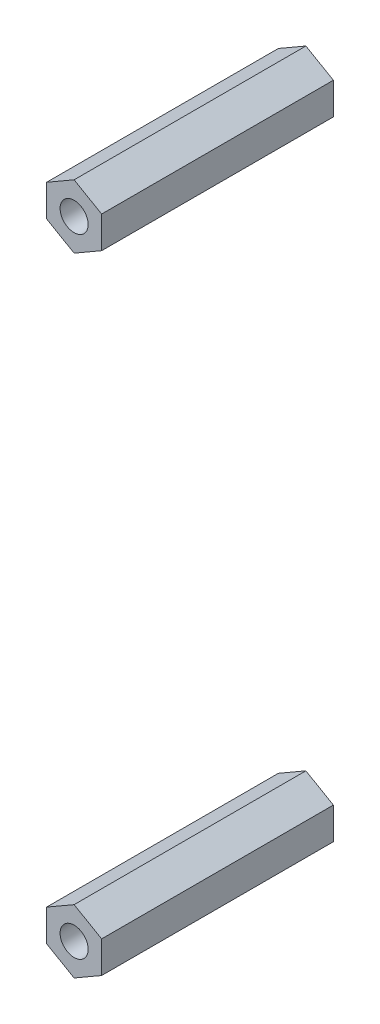
ISO-10303-21;
HEADER;
FILE_DESCRIPTION(('STEP AP214'),'2;1');
FILE_NAME('part.step','',(''),(''),'','','');
FILE_SCHEMA(('AUTOMOTIVE_DESIGN { 1 0 10303 214 1 1 1 1 }'));
ENDSEC;
DATA;
#1=APPLICATION_CONTEXT('core data for automotive mechanical design processes');
#2=APPLICATION_PROTOCOL_DEFINITION('international standard','automotive_design',2000,#1);
#3=PRODUCT_CONTEXT('',#1,'mechanical');
#4=PRODUCT('Part','Part','',(#3));
#5=PRODUCT_RELATED_PRODUCT_CATEGORY('part','',(#4));
#6=PRODUCT_DEFINITION_FORMATION('','',#4);
#7=PRODUCT_DEFINITION_CONTEXT('part definition',#1,'design');
#8=PRODUCT_DEFINITION('design','',#6,#7);
#9=PRODUCT_DEFINITION_SHAPE('','',#8);
#10=(LENGTH_UNIT() NAMED_UNIT(*) SI_UNIT(.MILLI.,.METRE.));
#11=(NAMED_UNIT(*) PLANE_ANGLE_UNIT() SI_UNIT($,.RADIAN.));
#12=(NAMED_UNIT(*) SI_UNIT($,.STERADIAN.) SOLID_ANGLE_UNIT());
#13=UNCERTAINTY_MEASURE_WITH_UNIT(LENGTH_MEASURE(1.E-05),#10,'distance_accuracy_value','');
#14=(GEOMETRIC_REPRESENTATION_CONTEXT(3) GLOBAL_UNCERTAINTY_ASSIGNED_CONTEXT((#13)) GLOBAL_UNIT_ASSIGNED_CONTEXT((#10,
#11,#12)) REPRESENTATION_CONTEXT('',''));
#15=CARTESIAN_POINT('',(0.,0.,0.));
#16=DIRECTION('',(0.,0.,1.));
#17=DIRECTION('',(1.,0.,0.));
#18=AXIS2_PLACEMENT_3D('',#15,#16,#17);
#19=CARTESIAN_POINT('',(-39.8780000000002,-45.4910072060575,111.324967005515));
#20=DIRECTION('',(-0.5,0.866025403784439,0.));
#21=DIRECTION('',(-0.866025403784439,-0.5,0.));
#22=AXIS2_PLACEMENT_3D('',#19,#20,#21);
#23=PLANE('',#22);
#24=DIRECTION('',(0.866025403784439,0.5,0.));
#25=VECTOR('',#24,1.);
#26=CARTESIAN_POINT('',(-39.8780000000002,-45.4910072060575,91.7701999999998));
#27=LINE('',#26,#25);
#28=CARTESIAN_POINT('',(-39.8780000000002,-45.4910072060575,91.7701999999998));
#29=VERTEX_POINT('',#28);
#30=CARTESIAN_POINT('',(-33.4772000000002,-41.7955036030285,91.7701999999998));
#31=VERTEX_POINT('',#30);
#32=EDGE_CURVE('E104',#29,#31,#27,.T.);
#33=ORIENTED_EDGE('',*,*,#32,.F.);
#34=DIRECTION('',(0.,0.,-1.));
#35=VECTOR('',#34,1.);
#36=CARTESIAN_POINT('',(-39.8780000000002,-45.4910072060575,111.324967005515));
#37=LINE('',#36,#35);
#38=CARTESIAN_POINT('',(-39.8780000000002,-45.4910072060575,37.8459999999998));
#39=VERTEX_POINT('',#38);
#40=EDGE_CURVE('E64',#29,#39,#37,.T.);
#41=ORIENTED_EDGE('',*,*,#40,.T.);
#42=DIRECTION('',(0.866025403784439,0.5,0.));
#43=VECTOR('',#42,1.);
#44=CARTESIAN_POINT('',(-39.8780000000002,-45.4910072060575,37.8459999999998));
#45=LINE('',#44,#43);
#46=CARTESIAN_POINT('',(-33.4772000000002,-41.7955036030285,37.8459999999998));
#47=VERTEX_POINT('',#46);
#48=EDGE_CURVE('E107',#39,#47,#45,.T.);
#49=ORIENTED_EDGE('',*,*,#48,.T.);
#50=DIRECTION('',(0.,0.,-1.));
#51=VECTOR('',#50,1.);
#52=CARTESIAN_POINT('',(-33.4772000000002,-41.7955036030285,111.324967005515));
#53=LINE('',#52,#51);
#54=EDGE_CURVE('E101',#31,#47,#53,.T.);
#55=ORIENTED_EDGE('',*,*,#54,.F.);
#56=EDGE_LOOP('',(#33,#41,#49,#55));
#57=FACE_BOUND('',#56,.T.);
#58=ADVANCED_FACE('F48',(#57),#23,.F.);
#59=CARTESIAN_POINT('',(-46.2788000000002,-41.7955036030285,111.324967005515));
#60=DIRECTION('',(0.499999999999999,0.866025403784439,0.));
#61=DIRECTION('',(-0.866025403784439,0.499999999999999,0.));
#62=AXIS2_PLACEMENT_3D('',#59,#60,#61);
#63=PLANE('',#62);
#64=DIRECTION('',(0.866025403784439,-0.499999999999999,0.));
#65=VECTOR('',#64,1.);
#66=CARTESIAN_POINT('',(-46.2788000000002,-41.7955036030285,91.7701999999998));
#67=LINE('',#66,#65);
#68=CARTESIAN_POINT('',(-46.2788000000002,-41.7955036030285,91.7701999999998));
#69=VERTEX_POINT('',#68);
#70=EDGE_CURVE('E119',#69,#29,#67,.T.);
#71=ORIENTED_EDGE('',*,*,#70,.F.);
#72=DIRECTION('',(0.,0.,-1.));
#73=VECTOR('',#72,1.);
#74=CARTESIAN_POINT('',(-46.2788000000002,-41.7955036030285,111.324967005515));
#75=LINE('',#74,#73);
#76=CARTESIAN_POINT('',(-46.2788000000002,-41.7955036030285,37.8459999999998));
#77=VERTEX_POINT('',#76);
#78=EDGE_CURVE('E147',#69,#77,#75,.T.);
#79=ORIENTED_EDGE('',*,*,#78,.T.);
#80=DIRECTION('',(0.866025403784439,-0.499999999999999,0.));
#81=VECTOR('',#80,1.);
#82=CARTESIAN_POINT('',(-46.2788000000002,-41.7955036030285,37.8459999999998));
#83=LINE('',#82,#81);
#84=EDGE_CURVE('E143',#77,#39,#83,.T.);
#85=ORIENTED_EDGE('',*,*,#84,.T.);
#86=ORIENTED_EDGE('',*,*,#40,.F.);
#87=EDGE_LOOP('',(#71,#79,#85,#86));
#88=FACE_BOUND('',#87,.T.);
#89=ADVANCED_FACE('F165',(#88),#63,.F.);
#90=CARTESIAN_POINT('',(-46.2788000000002,-34.4044963969706,111.324967005515));
#91=DIRECTION('',(1.,0.,0.));
#92=DIRECTION('',(0.,0.,-1.));
#93=AXIS2_PLACEMENT_3D('',#90,#91,#92);
#94=PLANE('',#93);
#95=DIRECTION('',(0.,-1.,0.));
#96=VECTOR('',#95,1.);
#97=CARTESIAN_POINT('',(-46.2788000000002,-34.4044963969706,91.7701999999998));
#98=LINE('',#97,#96);
#99=CARTESIAN_POINT('',(-46.2788000000002,-34.4044963969706,91.7701999999998));
#100=VERTEX_POINT('',#99);
#101=EDGE_CURVE('E121',#100,#69,#98,.T.);
#102=ORIENTED_EDGE('',*,*,#101,.F.);
#103=DIRECTION('',(0.,0.,-1.));
#104=VECTOR('',#103,1.);
#105=CARTESIAN_POINT('',(-46.2788000000002,-34.4044963969706,111.324967005515));
#106=LINE('',#105,#104);
#107=CARTESIAN_POINT('',(-46.2788000000002,-34.4044963969706,37.8459999999998));
#108=VERTEX_POINT('',#107);
#109=EDGE_CURVE('E149',#100,#108,#106,.T.);
#110=ORIENTED_EDGE('',*,*,#109,.T.);
#111=DIRECTION('',(0.,-1.,0.));
#112=VECTOR('',#111,1.);
#113=CARTESIAN_POINT('',(-46.2788000000002,-34.4044963969706,37.8459999999998));
#114=LINE('',#113,#112);
#115=EDGE_CURVE('E140',#108,#77,#114,.T.);
#116=ORIENTED_EDGE('',*,*,#115,.T.);
#117=ORIENTED_EDGE('',*,*,#78,.F.);
#118=EDGE_LOOP('',(#102,#110,#116,#117));
#119=FACE_BOUND('',#118,.T.);
#120=ADVANCED_FACE('F164',(#119),#94,.F.);
#121=CARTESIAN_POINT('',(-39.8780000000002,-30.7089927939416,111.324967005515));
#122=DIRECTION('',(0.5,-0.866025403784438,0.));
#123=DIRECTION('',(0.866025403784439,0.5,0.));
#124=AXIS2_PLACEMENT_3D('',#121,#122,#123);
#125=PLANE('',#124);
#126=DIRECTION('',(-0.866025403784439,-0.5,0.));
#127=VECTOR('',#126,1.);
#128=CARTESIAN_POINT('',(-39.8780000000002,-30.7089927939416,91.7701999999998));
#129=LINE('',#128,#127);
#130=CARTESIAN_POINT('',(-39.8780000000002,-30.7089927939416,91.7701999999998));
#131=VERTEX_POINT('',#130);
#132=EDGE_CURVE('E126',#131,#100,#129,.T.);
#133=ORIENTED_EDGE('',*,*,#132,.F.);
#134=DIRECTION('',(0.,0.,-1.));
#135=VECTOR('',#134,1.);
#136=CARTESIAN_POINT('',(-39.8780000000002,-30.7089927939416,111.324967005515));
#137=LINE('',#136,#135);
#138=CARTESIAN_POINT('',(-39.8780000000002,-30.7089927939416,37.8459999999998));
#139=VERTEX_POINT('',#138);
#140=EDGE_CURVE('E57',#131,#139,#137,.T.);
#141=ORIENTED_EDGE('',*,*,#140,.T.);
#142=DIRECTION('',(-0.866025403784439,-0.5,0.));
#143=VECTOR('',#142,1.);
#144=CARTESIAN_POINT('',(-39.8780000000002,-30.7089927939416,37.8459999999998));
#145=LINE('',#144,#143);
#146=EDGE_CURVE('E137',#139,#108,#145,.T.);
#147=ORIENTED_EDGE('',*,*,#146,.T.);
#148=ORIENTED_EDGE('',*,*,#109,.F.);
#149=EDGE_LOOP('',(#133,#141,#147,#148));
#150=FACE_BOUND('',#149,.T.);
#151=ADVANCED_FACE('F152',(#150),#125,.F.);
#152=CARTESIAN_POINT('',(-33.4772000000002,-34.4044963969706,111.324967005515));
#153=DIRECTION('',(-0.5,-0.866025403784438,0.));
#154=DIRECTION('',(0.866025403784439,-0.5,0.));
#155=AXIS2_PLACEMENT_3D('',#152,#153,#154);
#156=PLANE('',#155);
#157=DIRECTION('',(-0.866025403784439,0.5,0.));
#158=VECTOR('',#157,1.);
#159=CARTESIAN_POINT('',(-33.4772000000002,-34.4044963969706,91.7701999999998));
#160=LINE('',#159,#158);
#161=CARTESIAN_POINT('',(-33.4772000000002,-34.4044963969706,91.7701999999998));
#162=VERTEX_POINT('',#161);
#163=EDGE_CURVE('E71',#162,#131,#160,.T.);
#164=ORIENTED_EDGE('',*,*,#163,.F.);
#165=DIRECTION('',(0.,0.,-1.));
#166=VECTOR('',#165,1.);
#167=CARTESIAN_POINT('',(-33.4772000000002,-34.4044963969706,111.324967005515));
#168=LINE('',#167,#166);
#169=CARTESIAN_POINT('',(-33.4772000000002,-34.4044963969706,37.8459999999998));
#170=VERTEX_POINT('',#169);
#171=EDGE_CURVE('E12',#162,#170,#168,.T.);
#172=ORIENTED_EDGE('',*,*,#171,.T.);
#173=DIRECTION('',(-0.866025403784438,0.5,0.));
#174=VECTOR('',#173,1.);
#175=CARTESIAN_POINT('',(-33.4772000000002,-34.4044963969706,37.8459999999998));
#176=LINE('',#175,#174);
#177=EDGE_CURVE('E134',#170,#139,#176,.T.);
#178=ORIENTED_EDGE('',*,*,#177,.T.);
#179=ORIENTED_EDGE('',*,*,#140,.F.);
#180=EDGE_LOOP('',(#164,#172,#178,#179));
#181=FACE_BOUND('',#180,.T.);
#182=ADVANCED_FACE('F157',(#181),#156,.F.);
#183=CARTESIAN_POINT('',(-33.4772000000002,-41.7955036030285,111.324967005515));
#184=DIRECTION('',(-1.,0.,0.));
#185=DIRECTION('',(0.,0.,1.));
#186=AXIS2_PLACEMENT_3D('',#183,#184,#185);
#187=PLANE('',#186);
#188=DIRECTION('',(0.,1.,0.));
#189=VECTOR('',#188,1.);
#190=CARTESIAN_POINT('',(-33.4772000000002,-41.7955036030285,91.7701999999998));
#191=LINE('',#190,#189);
#192=EDGE_CURVE('E113',#31,#162,#191,.T.);
#193=ORIENTED_EDGE('',*,*,#192,.F.);
#194=ORIENTED_EDGE('',*,*,#54,.T.);
#195=DIRECTION('',(0.,1.,0.));
#196=VECTOR('',#195,1.);
#197=CARTESIAN_POINT('',(-33.4772000000002,-41.7955036030285,37.8459999999998));
#198=LINE('',#197,#196);
#199=EDGE_CURVE('E132',#47,#170,#198,.T.);
#200=ORIENTED_EDGE('',*,*,#199,.T.);
#201=ORIENTED_EDGE('',*,*,#171,.F.);
#202=EDGE_LOOP('',(#193,#194,#200,#201));
#203=FACE_BOUND('',#202,.T.);
#204=ADVANCED_FACE('F50',(#203),#187,.F.);
#205=CARTESIAN_POINT('',(0.,0.,37.8459999999998));
#206=DIRECTION('',(0.,0.,1.));
#207=DIRECTION('',(1.,0.,0.));
#208=AXIS2_PLACEMENT_3D('',#205,#206,#207);
#209=PLANE('',#208);
#210=ORIENTED_EDGE('',*,*,#199,.F.);
#211=ORIENTED_EDGE('',*,*,#48,.F.);
#212=ORIENTED_EDGE('',*,*,#84,.F.);
#213=ORIENTED_EDGE('',*,*,#115,.F.);
#214=ORIENTED_EDGE('',*,*,#146,.F.);
#215=ORIENTED_EDGE('',*,*,#177,.F.);
#216=EDGE_LOOP('',(#210,#211,#212,#213,#214,#215));
#217=FACE_BOUND('',#216,.T.);
#218=CARTESIAN_POINT('',(-39.8780000000002,-38.0999999999995,37.8459999999998));
#219=DIRECTION('',(0.,0.,1.));
#220=DIRECTION('',(1.,0.,0.));
#221=AXIS2_PLACEMENT_3D('',#218,#219,#220);
#222=CIRCLE('',#221,3.2639);
#223=CARTESIAN_POINT('',(-36.6141000000002,-38.0999999999995,37.8459999999998));
#224=VERTEX_POINT('',#223);
#225=EDGE_CURVE('E115',#224,#224,#222,.T.);
#226=ORIENTED_EDGE('',*,*,#225,.T.);
#227=EDGE_LOOP('',(#226));
#228=FACE_BOUND('',#227,.T.);
#229=ADVANCED_FACE('F159',(#217,#228),#209,.F.);
#230=CARTESIAN_POINT('',(-39.8780000000002,-38.0999999999995,111.324967005515));
#231=DIRECTION('',(0.,0.,-1.));
#232=DIRECTION('',(-1.,0.,0.));
#233=AXIS2_PLACEMENT_3D('',#230,#231,#232);
#234=CYLINDRICAL_SURFACE('',#233,3.2639);
#235=ORIENTED_EDGE('',*,*,#225,.F.);
#236=EDGE_LOOP('',(#235));
#237=FACE_BOUND('',#236,.T.);
#238=CARTESIAN_POINT('',(-39.8780000000002,-38.0999999999995,91.7701999999998));
#239=DIRECTION('',(0.,0.,1.));
#240=DIRECTION('',(1.,0.,0.));
#241=AXIS2_PLACEMENT_3D('',#238,#239,#240);
#242=CIRCLE('',#241,3.2639);
#243=CARTESIAN_POINT('',(-36.6141000000002,-38.0999999999995,91.7701999999998));
#244=VERTEX_POINT('',#243);
#245=EDGE_CURVE('E52',#244,#244,#242,.T.);
#246=ORIENTED_EDGE('',*,*,#245,.T.);
#247=EDGE_LOOP('',(#246));
#248=FACE_BOUND('',#247,.T.);
#249=ADVANCED_FACE('F184',(#237,#248),#234,.F.);
#250=CARTESIAN_POINT('',(-44.45,85.7250000000007,91.7701999999998));
#251=DIRECTION('',(0.,0.,1.));
#252=DIRECTION('',(0.5,0.866025403784439,0.));
#253=AXIS2_PLACEMENT_3D('',#250,#251,#252);
#254=PLANE('',#253);
#255=ORIENTED_EDGE('',*,*,#245,.F.);
#256=EDGE_LOOP('',(#255));
#257=FACE_BOUND('',#256,.T.);
#258=ORIENTED_EDGE('',*,*,#32,.T.);
#259=ORIENTED_EDGE('',*,*,#192,.T.);
#260=ORIENTED_EDGE('',*,*,#163,.T.);
#261=ORIENTED_EDGE('',*,*,#132,.T.);
#262=ORIENTED_EDGE('',*,*,#101,.T.);
#263=ORIENTED_EDGE('',*,*,#70,.T.);
#264=EDGE_LOOP('',(#258,#259,#260,#261,#262,#263));
#265=FACE_BOUND('',#264,.T.);
#266=ADVANCED_FACE('F117',(#257,#265),#254,.T.);
#267=CLOSED_SHELL('',(#58,#89,#120,#151,#182,#204,#229,#249,#266));
#268=MANIFOLD_SOLID_BREP('B2',#267);
#269=CARTESIAN_POINT('',(-46.2788000000003,104.254496396972,111.324967005515));
#270=DIRECTION('',(0.5,0.866025403784439,0.));
#271=DIRECTION('',(-0.866025403784439,0.5,0.));
#272=AXIS2_PLACEMENT_3D('',#269,#270,#271);
#273=PLANE('',#272);
#274=DIRECTION('',(0.866025403784439,-0.5,0.));
#275=VECTOR('',#274,1.);
#276=CARTESIAN_POINT('',(-46.2788000000003,104.254496396972,91.7701999999998));
#277=LINE('',#276,#275);
#278=CARTESIAN_POINT('',(-46.2788000000003,104.254496396972,91.7701999999998));
#279=VERTEX_POINT('',#278);
#280=CARTESIAN_POINT('',(-39.8780000000002,100.558992793943,91.7701999999998));
#281=VERTEX_POINT('',#280);
#282=EDGE_CURVE('E307',#279,#281,#277,.T.);
#283=ORIENTED_EDGE('',*,*,#282,.F.);
#284=DIRECTION('',(0.,0.,-1.));
#285=VECTOR('',#284,1.);
#286=CARTESIAN_POINT('',(-46.2788000000003,104.254496396972,111.324967005515));
#287=LINE('',#286,#285);
#288=CARTESIAN_POINT('',(-46.2788000000003,104.254496396972,37.8459999999998));
#289=VERTEX_POINT('',#288);
#290=EDGE_CURVE('E261',#279,#289,#287,.T.);
#291=ORIENTED_EDGE('',*,*,#290,.T.);
#292=DIRECTION('',(0.866025403784439,-0.5,0.));
#293=VECTOR('',#292,1.);
#294=CARTESIAN_POINT('',(-46.2788000000003,104.254496396972,37.8459999999998));
#295=LINE('',#294,#293);
#296=CARTESIAN_POINT('',(-39.8780000000002,100.558992793943,37.8459999999998));
#297=VERTEX_POINT('',#296);
#298=EDGE_CURVE('E310',#289,#297,#295,.T.);
#299=ORIENTED_EDGE('',*,*,#298,.T.);
#300=DIRECTION('',(0.,0.,-1.));
#301=VECTOR('',#300,1.);
#302=CARTESIAN_POINT('',(-39.8780000000002,100.558992793943,111.324967005515));
#303=LINE('',#302,#301);
#304=EDGE_CURVE('E304',#281,#297,#303,.T.);
#305=ORIENTED_EDGE('',*,*,#304,.F.);
#306=EDGE_LOOP('',(#283,#291,#299,#305));
#307=FACE_BOUND('',#306,.T.);
#308=ADVANCED_FACE('F244',(#307),#273,.F.);
#309=CARTESIAN_POINT('',(-46.2788000000003,111.645503603029,111.324967005515));
#310=DIRECTION('',(1.,0.,0.));
#311=DIRECTION('',(0.,0.,-1.));
#312=AXIS2_PLACEMENT_3D('',#309,#310,#311);
#313=PLANE('',#312);
#314=DIRECTION('',(0.,-1.,0.));
#315=VECTOR('',#314,1.);
#316=CARTESIAN_POINT('',(-46.2788000000003,111.645503603029,91.7701999999998));
#317=LINE('',#316,#315);
#318=CARTESIAN_POINT('',(-46.2788000000003,111.645503603029,91.7701999999998));
#319=VERTEX_POINT('',#318);
#320=EDGE_CURVE('E323',#319,#279,#317,.T.);
#321=ORIENTED_EDGE('',*,*,#320,.F.);
#322=DIRECTION('',(0.,0.,-1.));
#323=VECTOR('',#322,1.);
#324=CARTESIAN_POINT('',(-46.2788000000003,111.645503603029,111.324967005515));
#325=LINE('',#324,#323);
#326=CARTESIAN_POINT('',(-46.2788000000003,111.645503603029,37.8459999999998));
#327=VERTEX_POINT('',#326);
#328=EDGE_CURVE('E359',#319,#327,#325,.T.);
#329=ORIENTED_EDGE('',*,*,#328,.T.);
#330=DIRECTION('',(0.,-1.,0.));
#331=VECTOR('',#330,1.);
#332=CARTESIAN_POINT('',(-46.2788000000003,111.645503603029,37.8459999999998));
#333=LINE('',#332,#331);
#334=EDGE_CURVE('E352',#327,#289,#333,.T.);
#335=ORIENTED_EDGE('',*,*,#334,.T.);
#336=ORIENTED_EDGE('',*,*,#290,.F.);
#337=EDGE_LOOP('',(#321,#329,#335,#336));
#338=FACE_BOUND('',#337,.T.);
#339=ADVANCED_FACE('F380',(#338),#313,.F.);
#340=CARTESIAN_POINT('',(-39.8780000000003,115.341007206058,111.324967005515));
#341=DIRECTION('',(0.5,-0.866025403784439,0.));
#342=DIRECTION('',(0.866025403784439,0.5,0.));
#343=AXIS2_PLACEMENT_3D('',#340,#341,#342);
#344=PLANE('',#343);
#345=DIRECTION('',(-0.866025403784439,-0.5,0.));
#346=VECTOR('',#345,1.);
#347=CARTESIAN_POINT('',(-39.8780000000003,115.341007206058,91.7701999999998));
#348=LINE('',#347,#346);
#349=CARTESIAN_POINT('',(-39.8780000000003,115.341007206058,91.7701999999998));
#350=VERTEX_POINT('',#349);
#351=EDGE_CURVE('E325',#350,#319,#348,.T.);
#352=ORIENTED_EDGE('',*,*,#351,.F.);
#353=DIRECTION('',(0.,0.,-1.));
#354=VECTOR('',#353,1.);
#355=CARTESIAN_POINT('',(-39.8780000000003,115.341007206058,111.324967005515));
#356=LINE('',#355,#354);
#357=CARTESIAN_POINT('',(-39.8780000000003,115.341007206058,37.8459999999998));
#358=VERTEX_POINT('',#357);
#359=EDGE_CURVE('E362',#350,#358,#356,.T.);
#360=ORIENTED_EDGE('',*,*,#359,.T.);
#361=DIRECTION('',(-0.866025403784439,-0.5,0.));
#362=VECTOR('',#361,1.);
#363=CARTESIAN_POINT('',(-39.8780000000003,115.341007206058,37.8459999999998));
#364=LINE('',#363,#362);
#365=EDGE_CURVE('E348',#358,#327,#364,.T.);
#366=ORIENTED_EDGE('',*,*,#365,.T.);
#367=ORIENTED_EDGE('',*,*,#328,.F.);
#368=EDGE_LOOP('',(#352,#360,#366,#367));
#369=FACE_BOUND('',#368,.T.);
#370=ADVANCED_FACE('F379',(#369),#344,.F.);
#371=CARTESIAN_POINT('',(-33.4772000000003,111.645503603029,111.324967005515));
#372=DIRECTION('',(-0.499999999999998,-0.866025403784439,0.));
#373=DIRECTION('',(0.86602540378444,-0.499999999999999,0.));
#374=AXIS2_PLACEMENT_3D('',#371,#372,#373);
#375=PLANE('',#374);
#376=DIRECTION('',(-0.86602540378444,0.499999999999999,0.));
#377=VECTOR('',#376,1.);
#378=CARTESIAN_POINT('',(-33.4772000000003,111.645503603029,91.7701999999998));
#379=LINE('',#378,#377);
#380=CARTESIAN_POINT('',(-33.4772000000003,111.645503603029,91.7701999999998));
#381=VERTEX_POINT('',#380);
#382=EDGE_CURVE('E330',#381,#350,#379,.T.);
#383=ORIENTED_EDGE('',*,*,#382,.F.);
#384=DIRECTION('',(0.,0.,-1.));
#385=VECTOR('',#384,1.);
#386=CARTESIAN_POINT('',(-33.4772000000003,111.645503603029,111.324967005515));
#387=LINE('',#386,#385);
#388=CARTESIAN_POINT('',(-33.4772000000003,111.645503603029,37.8459999999998));
#389=VERTEX_POINT('',#388);
#390=EDGE_CURVE('E254',#381,#389,#387,.T.);
#391=ORIENTED_EDGE('',*,*,#390,.T.);
#392=DIRECTION('',(-0.866025403784439,0.499999999999999,0.));
#393=VECTOR('',#392,1.);
#394=CARTESIAN_POINT('',(-33.4772000000003,111.645503603029,37.8459999999998));
#395=LINE('',#394,#393);
#396=EDGE_CURVE('E344',#389,#358,#395,.T.);
#397=ORIENTED_EDGE('',*,*,#396,.T.);
#398=ORIENTED_EDGE('',*,*,#359,.F.);
#399=EDGE_LOOP('',(#383,#391,#397,#398));
#400=FACE_BOUND('',#399,.T.);
#401=ADVANCED_FACE('F367',(#400),#375,.F.);
#402=CARTESIAN_POINT('',(-33.4772000000002,104.254496396971,111.324967005515));
#403=DIRECTION('',(-1.,0.,0.));
#404=DIRECTION('',(0.,-1.,0.));
#405=AXIS2_PLACEMENT_3D('',#402,#403,#404);
#406=PLANE('',#405);
#407=DIRECTION('',(0.,1.,0.));
#408=VECTOR('',#407,1.);
#409=CARTESIAN_POINT('',(-33.4772000000002,104.254496396971,91.7701999999998));
#410=LINE('',#409,#408);
#411=CARTESIAN_POINT('',(-33.4772000000002,104.254496396971,91.7701999999998));
#412=VERTEX_POINT('',#411);
#413=EDGE_CURVE('E268',#412,#381,#410,.T.);
#414=ORIENTED_EDGE('',*,*,#413,.F.);
#415=DIRECTION('',(0.,0.,-1.));
#416=VECTOR('',#415,1.);
#417=CARTESIAN_POINT('',(-33.4772000000002,104.254496396971,111.324967005515));
#418=LINE('',#417,#416);
#419=CARTESIAN_POINT('',(-33.4772000000002,104.254496396971,37.8459999999998));
#420=VERTEX_POINT('',#419);
#421=EDGE_CURVE('E46',#412,#420,#418,.T.);
#422=ORIENTED_EDGE('',*,*,#421,.T.);
#423=DIRECTION('',(0.,1.,0.));
#424=VECTOR('',#423,1.);
#425=CARTESIAN_POINT('',(-33.4772000000002,104.254496396971,37.8459999999998));
#426=LINE('',#425,#424);
#427=EDGE_CURVE('E340',#420,#389,#426,.T.);
#428=ORIENTED_EDGE('',*,*,#427,.T.);
#429=ORIENTED_EDGE('',*,*,#390,.F.);
#430=EDGE_LOOP('',(#414,#422,#428,#429));
#431=FACE_BOUND('',#430,.T.);
#432=ADVANCED_FACE('F372',(#431),#406,.F.);
#433=CARTESIAN_POINT('',(-39.8780000000002,100.558992793943,111.324967005515));
#434=DIRECTION('',(-0.5,0.866025403784439,0.));
#435=DIRECTION('',(-0.866025403784439,-0.5,0.));
#436=AXIS2_PLACEMENT_3D('',#433,#434,#435);
#437=PLANE('',#436);
#438=DIRECTION('',(0.866025403784439,0.5,0.));
#439=VECTOR('',#438,1.);
#440=CARTESIAN_POINT('',(-39.8780000000002,100.558992793943,91.7701999999998));
#441=LINE('',#440,#439);
#442=EDGE_CURVE('E317',#281,#412,#441,.T.);
#443=ORIENTED_EDGE('',*,*,#442,.F.);
#444=ORIENTED_EDGE('',*,*,#304,.T.);
#445=DIRECTION('',(0.866025403784439,0.5,0.));
#446=VECTOR('',#445,1.);
#447=CARTESIAN_POINT('',(-39.8780000000002,100.558992793943,37.8459999999998));
#448=LINE('',#447,#446);
#449=EDGE_CURVE('E337',#297,#420,#448,.T.);
#450=ORIENTED_EDGE('',*,*,#449,.T.);
#451=ORIENTED_EDGE('',*,*,#421,.F.);
#452=EDGE_LOOP('',(#443,#444,#450,#451));
#453=FACE_BOUND('',#452,.T.);
#454=ADVANCED_FACE('F246',(#453),#437,.F.);
#455=CARTESIAN_POINT('',(0.,0.,37.8459999999998));
#456=DIRECTION('',(0.,0.,1.));
#457=DIRECTION('',(1.,0.,0.));
#458=AXIS2_PLACEMENT_3D('',#455,#456,#457);
#459=PLANE('',#458);
#460=ORIENTED_EDGE('',*,*,#449,.F.);
#461=ORIENTED_EDGE('',*,*,#298,.F.);
#462=ORIENTED_EDGE('',*,*,#334,.F.);
#463=ORIENTED_EDGE('',*,*,#365,.F.);
#464=ORIENTED_EDGE('',*,*,#396,.F.);
#465=ORIENTED_EDGE('',*,*,#427,.F.);
#466=EDGE_LOOP('',(#460,#461,#462,#463,#464,#465));
#467=FACE_BOUND('',#466,.T.);
#468=CARTESIAN_POINT('',(-39.8780000000003,107.95,37.8459999999998));
#469=DIRECTION('',(0.,0.,1.));
#470=DIRECTION('',(1.,0.,0.));
#471=AXIS2_PLACEMENT_3D('',#468,#469,#470);
#472=CIRCLE('',#471,3.2639);
#473=CARTESIAN_POINT('',(-36.6141000000003,107.95,37.8459999999998));
#474=VERTEX_POINT('',#473);
#475=EDGE_CURVE('E319',#474,#474,#472,.T.);
#476=ORIENTED_EDGE('',*,*,#475,.T.);
#477=EDGE_LOOP('',(#476));
#478=FACE_BOUND('',#477,.T.);
#479=ADVANCED_FACE('F374',(#467,#478),#459,.F.);
#480=CARTESIAN_POINT('',(-39.8780000000003,107.95,111.324967005515));
#481=DIRECTION('',(0.,0.,-1.));
#482=DIRECTION('',(-1.,0.,0.));
#483=AXIS2_PLACEMENT_3D('',#480,#481,#482);
#484=CYLINDRICAL_SURFACE('',#483,3.2639);
#485=ORIENTED_EDGE('',*,*,#475,.F.);
#486=EDGE_LOOP('',(#485));
#487=FACE_BOUND('',#486,.T.);
#488=CARTESIAN_POINT('',(-39.8780000000003,107.95,91.7701999999998));
#489=DIRECTION('',(0.,0.,1.));
#490=DIRECTION('',(1.,0.,0.));
#491=AXIS2_PLACEMENT_3D('',#488,#489,#490);
#492=CIRCLE('',#491,3.2639);
#493=CARTESIAN_POINT('',(-36.6141000000003,107.95,91.7701999999998));
#494=VERTEX_POINT('',#493);
#495=EDGE_CURVE('E248',#494,#494,#492,.T.);
#496=ORIENTED_EDGE('',*,*,#495,.T.);
#497=EDGE_LOOP('',(#496));
#498=FACE_BOUND('',#497,.T.);
#499=ADVANCED_FACE('F399',(#487,#498),#484,.F.);
#500=CARTESIAN_POINT('',(-44.45,85.7250000000007,91.7701999999998));
#501=DIRECTION('',(0.,0.,1.));
#502=DIRECTION('',(0.5,0.866025403784439,0.));
#503=AXIS2_PLACEMENT_3D('',#500,#501,#502);
#504=PLANE('',#503);
#505=ORIENTED_EDGE('',*,*,#495,.F.);
#506=EDGE_LOOP('',(#505));
#507=FACE_BOUND('',#506,.T.);
#508=ORIENTED_EDGE('',*,*,#282,.T.);
#509=ORIENTED_EDGE('',*,*,#442,.T.);
#510=ORIENTED_EDGE('',*,*,#413,.T.);
#511=ORIENTED_EDGE('',*,*,#382,.T.);
#512=ORIENTED_EDGE('',*,*,#351,.T.);
#513=ORIENTED_EDGE('',*,*,#320,.T.);
#514=EDGE_LOOP('',(#508,#509,#510,#511,#512,#513));
#515=FACE_BOUND('',#514,.T.);
#516=ADVANCED_FACE('F321',(#507,#515),#504,.T.);
#517=CLOSED_SHELL('',(#308,#339,#370,#401,#432,#454,#479,#499,#516));
#518=MANIFOLD_SOLID_BREP('B6',#517);
#519=ADVANCED_BREP_SHAPE_REPRESENTATION('',(#18,#268,#518),#14);
#520=SHAPE_DEFINITION_REPRESENTATION(#9,#519);
ENDSEC;
END-ISO-10303-21;
